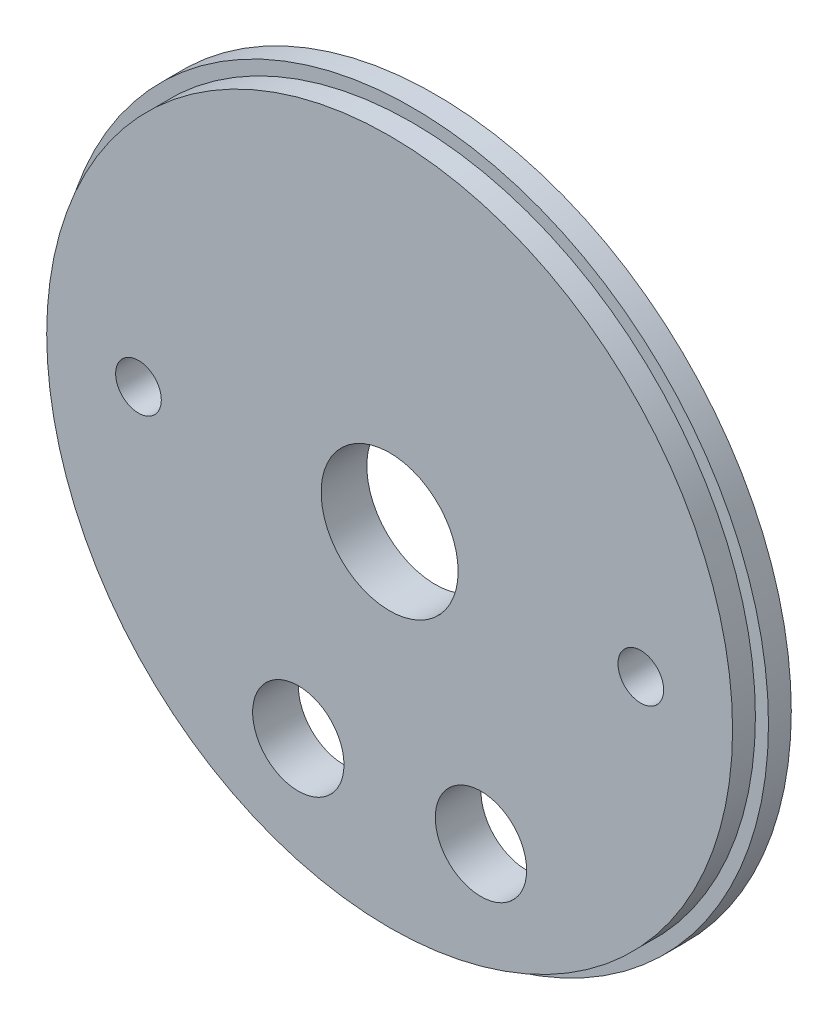
ISO-10303-21;
HEADER;
FILE_DESCRIPTION(('STEP AP214'),'2;1');
FILE_NAME('part.step','',(''),(''),'','','');
FILE_SCHEMA(('AUTOMOTIVE_DESIGN { 1 0 10303 214 1 1 1 1 }'));
ENDSEC;
DATA;
#1=APPLICATION_CONTEXT('core data for automotive mechanical design processes');
#2=APPLICATION_PROTOCOL_DEFINITION('international standard','automotive_design',2000,#1);
#3=PRODUCT_CONTEXT('',#1,'mechanical');
#4=PRODUCT('Part','Part','',(#3));
#5=PRODUCT_RELATED_PRODUCT_CATEGORY('part','',(#4));
#6=PRODUCT_DEFINITION_FORMATION('','',#4);
#7=PRODUCT_DEFINITION_CONTEXT('part definition',#1,'design');
#8=PRODUCT_DEFINITION('design','',#6,#7);
#9=PRODUCT_DEFINITION_SHAPE('','',#8);
#10=(LENGTH_UNIT() NAMED_UNIT(*) SI_UNIT(.MILLI.,.METRE.));
#11=(NAMED_UNIT(*) PLANE_ANGLE_UNIT() SI_UNIT($,.RADIAN.));
#12=(NAMED_UNIT(*) SI_UNIT($,.STERADIAN.) SOLID_ANGLE_UNIT());
#13=UNCERTAINTY_MEASURE_WITH_UNIT(LENGTH_MEASURE(1.E-05),#10,'distance_accuracy_value','');
#14=(GEOMETRIC_REPRESENTATION_CONTEXT(3) GLOBAL_UNCERTAINTY_ASSIGNED_CONTEXT((#13)) GLOBAL_UNIT_ASSIGNED_CONTEXT((#10,
#11,#12)) REPRESENTATION_CONTEXT('',''));
#15=CARTESIAN_POINT('',(0.,0.,0.));
#16=DIRECTION('',(0.,0.,1.));
#17=DIRECTION('',(1.,0.,0.));
#18=AXIS2_PLACEMENT_3D('',#15,#16,#17);
#19=CARTESIAN_POINT('',(0.,0.,3.175));
#20=DIRECTION('',(0.,0.,-1.));
#21=DIRECTION('',(-1.,0.,0.));
#22=AXIS2_PLACEMENT_3D('',#19,#20,#21);
#23=CYLINDRICAL_SURFACE('',#22,49.5046);
#24=CARTESIAN_POINT('',(0.,0.,3.175));
#25=DIRECTION('',(0.,0.,1.));
#26=DIRECTION('',(1.,0.,0.));
#27=AXIS2_PLACEMENT_3D('',#24,#25,#26);
#28=CIRCLE('',#27,49.5046);
#29=CARTESIAN_POINT('',(49.5046,0.,3.175));
#30=VERTEX_POINT('',#29);
#31=EDGE_CURVE('E40',#30,#30,#28,.T.);
#32=ORIENTED_EDGE('',*,*,#31,.F.);
#33=EDGE_LOOP('',(#32));
#34=FACE_BOUND('',#33,.T.);
#35=CARTESIAN_POINT('',(0.,0.,0.));
#36=DIRECTION('',(0.,0.,1.));
#37=DIRECTION('',(1.,0.,0.));
#38=AXIS2_PLACEMENT_3D('',#35,#36,#37);
#39=CIRCLE('',#38,49.5046);
#40=CARTESIAN_POINT('',(49.5046,0.,0.));
#41=VERTEX_POINT('',#40);
#42=EDGE_CURVE('E36',#41,#41,#39,.T.);
#43=ORIENTED_EDGE('',*,*,#42,.T.);
#44=EDGE_LOOP('',(#43));
#45=FACE_BOUND('',#44,.T.);
#46=ADVANCED_FACE('F33',(#34,#45),#23,.T.);
#47=CARTESIAN_POINT('',(0.,0.,3.175));
#48=DIRECTION('',(0.,0.,1.));
#49=DIRECTION('',(1.,0.,0.));
#50=AXIS2_PLACEMENT_3D('',#47,#48,#49);
#51=PLANE('',#50);
#52=CARTESIAN_POINT('',(0.,0.,3.175));
#53=DIRECTION('',(0.,0.,1.));
#54=DIRECTION('',(1.,0.,0.));
#55=AXIS2_PLACEMENT_3D('',#52,#53,#54);
#56=CIRCLE('',#55,47.6885);
#57=CARTESIAN_POINT('',(47.6885,0.,3.175));
#58=VERTEX_POINT('',#57);
#59=EDGE_CURVE('E10',#58,#58,#56,.T.);
#60=ORIENTED_EDGE('',*,*,#59,.F.);
#61=EDGE_LOOP('',(#60));
#62=FACE_BOUND('',#61,.T.);
#63=ORIENTED_EDGE('',*,*,#31,.T.);
#64=EDGE_LOOP('',(#63));
#65=FACE_BOUND('',#64,.T.);
#66=ADVANCED_FACE('F109',(#62,#65),#51,.T.);
#67=CARTESIAN_POINT('',(0.,0.,0.));
#68=DIRECTION('',(0.,0.,1.));
#69=DIRECTION('',(1.,0.,0.));
#70=AXIS2_PLACEMENT_3D('',#67,#68,#69);
#71=PLANE('',#70);
#72=CARTESIAN_POINT('',(12.7,-31.2353524431853,0.));
#73=DIRECTION('',(0.,0.,1.));
#74=DIRECTION('',(1.,0.,0.));
#75=AXIS2_PLACEMENT_3D('',#72,#73,#74);
#76=CIRCLE('',#75,6.35);
#77=CARTESIAN_POINT('',(19.05,-31.2353524431853,0.));
#78=VERTEX_POINT('',#77);
#79=EDGE_CURVE('E53',#78,#78,#76,.T.);
#80=ORIENTED_EDGE('',*,*,#79,.T.);
#81=EDGE_LOOP('',(#80));
#82=FACE_BOUND('',#81,.T.);
#83=CARTESIAN_POINT('',(-34.925,0.,0.));
#84=DIRECTION('',(0.,0.,1.));
#85=DIRECTION('',(1.,0.,0.));
#86=AXIS2_PLACEMENT_3D('',#83,#84,#85);
#87=CIRCLE('',#86,3.17500000000001);
#88=CARTESIAN_POINT('',(-31.75,0.,0.));
#89=VERTEX_POINT('',#88);
#90=EDGE_CURVE('E59',#89,#89,#87,.T.);
#91=ORIENTED_EDGE('',*,*,#90,.T.);
#92=EDGE_LOOP('',(#91));
#93=FACE_BOUND('',#92,.T.);
#94=CARTESIAN_POINT('',(34.925,0.,0.));
#95=DIRECTION('',(0.,0.,1.));
#96=DIRECTION('',(1.,0.,0.));
#97=AXIS2_PLACEMENT_3D('',#94,#95,#96);
#98=CIRCLE('',#97,3.175);
#99=CARTESIAN_POINT('',(38.1,0.,0.));
#100=VERTEX_POINT('',#99);
#101=EDGE_CURVE('E60',#100,#100,#98,.T.);
#102=ORIENTED_EDGE('',*,*,#101,.T.);
#103=EDGE_LOOP('',(#102));
#104=FACE_BOUND('',#103,.T.);
#105=CARTESIAN_POINT('',(0.,0.,0.));
#106=DIRECTION('',(0.,0.,1.));
#107=DIRECTION('',(1.,0.,0.));
#108=AXIS2_PLACEMENT_3D('',#105,#106,#107);
#109=CIRCLE('',#108,9.525);
#110=CARTESIAN_POINT('',(9.525,0.,0.));
#111=VERTEX_POINT('',#110);
#112=EDGE_CURVE('E71',#111,#111,#109,.T.);
#113=ORIENTED_EDGE('',*,*,#112,.T.);
#114=EDGE_LOOP('',(#113));
#115=FACE_BOUND('',#114,.T.);
#116=CARTESIAN_POINT('',(-12.7,-31.2353524431853,0.));
#117=DIRECTION('',(0.,0.,1.));
#118=DIRECTION('',(1.,0.,0.));
#119=AXIS2_PLACEMENT_3D('',#116,#117,#118);
#120=CIRCLE('',#119,6.35);
#121=CARTESIAN_POINT('',(-6.35,-31.2353524431853,0.));
#122=VERTEX_POINT('',#121);
#123=EDGE_CURVE('E49',#122,#122,#120,.T.);
#124=ORIENTED_EDGE('',*,*,#123,.T.);
#125=EDGE_LOOP('',(#124));
#126=FACE_BOUND('',#125,.T.);
#127=ORIENTED_EDGE('',*,*,#42,.F.);
#128=EDGE_LOOP('',(#127));
#129=FACE_BOUND('',#128,.T.);
#130=ADVANCED_FACE('F80',(#82,#93,#104,#115,#126,#129),#71,.F.);
#131=CARTESIAN_POINT('',(0.,0.,6.35));
#132=DIRECTION('',(0.,0.,-1.));
#133=DIRECTION('',(-1.,0.,0.));
#134=AXIS2_PLACEMENT_3D('',#131,#132,#133);
#135=CYLINDRICAL_SURFACE('',#134,47.6885);
#136=CARTESIAN_POINT('',(0.,0.,6.35));
#137=DIRECTION('',(0.,0.,1.));
#138=DIRECTION('',(1.,0.,0.));
#139=AXIS2_PLACEMENT_3D('',#136,#137,#138);
#140=CIRCLE('',#139,47.6885);
#141=CARTESIAN_POINT('',(47.6885,0.,6.35));
#142=VERTEX_POINT('',#141);
#143=EDGE_CURVE('E46',#142,#142,#140,.T.);
#144=ORIENTED_EDGE('',*,*,#143,.F.);
#145=EDGE_LOOP('',(#144));
#146=FACE_BOUND('',#145,.T.);
#147=ORIENTED_EDGE('',*,*,#59,.T.);
#148=EDGE_LOOP('',(#147));
#149=FACE_BOUND('',#148,.T.);
#150=ADVANCED_FACE('F95',(#146,#149),#135,.T.);
#151=CARTESIAN_POINT('',(0.,0.,6.35));
#152=DIRECTION('',(0.,0.,1.));
#153=DIRECTION('',(1.,0.,0.));
#154=AXIS2_PLACEMENT_3D('',#151,#152,#153);
#155=PLANE('',#154);
#156=CARTESIAN_POINT('',(12.7,-31.2353524431853,6.35));
#157=DIRECTION('',(0.,0.,1.));
#158=DIRECTION('',(1.,0.,0.));
#159=AXIS2_PLACEMENT_3D('',#156,#157,#158);
#160=CIRCLE('',#159,6.35);
#161=CARTESIAN_POINT('',(19.05,-31.2353524431853,6.35));
#162=VERTEX_POINT('',#161);
#163=EDGE_CURVE('E63',#162,#162,#160,.T.);
#164=ORIENTED_EDGE('',*,*,#163,.F.);
#165=EDGE_LOOP('',(#164));
#166=FACE_BOUND('',#165,.T.);
#167=CARTESIAN_POINT('',(-34.925,0.,6.35));
#168=DIRECTION('',(0.,0.,1.));
#169=DIRECTION('',(1.,0.,0.));
#170=AXIS2_PLACEMENT_3D('',#167,#168,#169);
#171=CIRCLE('',#170,3.17500000000001);
#172=CARTESIAN_POINT('',(-31.75,0.,6.35));
#173=VERTEX_POINT('',#172);
#174=EDGE_CURVE('E56',#173,#173,#171,.T.);
#175=ORIENTED_EDGE('',*,*,#174,.F.);
#176=EDGE_LOOP('',(#175));
#177=FACE_BOUND('',#176,.T.);
#178=CARTESIAN_POINT('',(34.925,0.,6.35));
#179=DIRECTION('',(0.,0.,1.));
#180=DIRECTION('',(1.,0.,0.));
#181=AXIS2_PLACEMENT_3D('',#178,#179,#180);
#182=CIRCLE('',#181,3.175);
#183=CARTESIAN_POINT('',(38.1,0.,6.35));
#184=VERTEX_POINT('',#183);
#185=EDGE_CURVE('E74',#184,#184,#182,.T.);
#186=ORIENTED_EDGE('',*,*,#185,.F.);
#187=EDGE_LOOP('',(#186));
#188=FACE_BOUND('',#187,.T.);
#189=CARTESIAN_POINT('',(0.,0.,6.35));
#190=DIRECTION('',(0.,0.,1.));
#191=DIRECTION('',(1.,0.,0.));
#192=AXIS2_PLACEMENT_3D('',#189,#190,#191);
#193=CIRCLE('',#192,9.525);
#194=CARTESIAN_POINT('',(9.525,0.,6.35));
#195=VERTEX_POINT('',#194);
#196=EDGE_CURVE('E68',#195,#195,#193,.T.);
#197=ORIENTED_EDGE('',*,*,#196,.F.);
#198=EDGE_LOOP('',(#197));
#199=FACE_BOUND('',#198,.T.);
#200=CARTESIAN_POINT('',(-12.7,-31.2353524431853,6.35));
#201=DIRECTION('',(0.,0.,1.));
#202=DIRECTION('',(1.,0.,0.));
#203=AXIS2_PLACEMENT_3D('',#200,#201,#202);
#204=CIRCLE('',#203,6.35);
#205=CARTESIAN_POINT('',(-6.35,-31.2353524431853,6.35));
#206=VERTEX_POINT('',#205);
#207=EDGE_CURVE('E50',#206,#206,#204,.T.);
#208=ORIENTED_EDGE('',*,*,#207,.F.);
#209=EDGE_LOOP('',(#208));
#210=FACE_BOUND('',#209,.T.);
#211=ORIENTED_EDGE('',*,*,#143,.T.);
#212=EDGE_LOOP('',(#211));
#213=FACE_BOUND('',#212,.T.);
#214=ADVANCED_FACE('F91',(#166,#177,#188,#199,#210,#213),#155,.T.);
#215=CARTESIAN_POINT('',(-12.7,-31.2353524431853,0.));
#216=DIRECTION('',(0.,0.,1.));
#217=DIRECTION('',(1.,0.,0.));
#218=AXIS2_PLACEMENT_3D('',#215,#216,#217);
#219=CYLINDRICAL_SURFACE('',#218,6.35);
#220=ORIENTED_EDGE('',*,*,#123,.F.);
#221=EDGE_LOOP('',(#220));
#222=FACE_BOUND('',#221,.T.);
#223=ORIENTED_EDGE('',*,*,#207,.T.);
#224=EDGE_LOOP('',(#223));
#225=FACE_BOUND('',#224,.T.);
#226=ADVANCED_FACE('F94',(#222,#225),#219,.F.);
#227=CARTESIAN_POINT('',(0.,0.,0.));
#228=DIRECTION('',(0.,0.,1.));
#229=DIRECTION('',(1.,0.,0.));
#230=AXIS2_PLACEMENT_3D('',#227,#228,#229);
#231=CYLINDRICAL_SURFACE('',#230,9.525);
#232=ORIENTED_EDGE('',*,*,#112,.F.);
#233=EDGE_LOOP('',(#232));
#234=FACE_BOUND('',#233,.T.);
#235=ORIENTED_EDGE('',*,*,#196,.T.);
#236=EDGE_LOOP('',(#235));
#237=FACE_BOUND('',#236,.T.);
#238=ADVANCED_FACE('F87',(#234,#237),#231,.F.);
#239=CARTESIAN_POINT('',(34.925,0.,0.));
#240=DIRECTION('',(0.,0.,1.));
#241=DIRECTION('',(1.,0.,0.));
#242=AXIS2_PLACEMENT_3D('',#239,#240,#241);
#243=CYLINDRICAL_SURFACE('',#242,3.175);
#244=ORIENTED_EDGE('',*,*,#101,.F.);
#245=EDGE_LOOP('',(#244));
#246=FACE_BOUND('',#245,.T.);
#247=ORIENTED_EDGE('',*,*,#185,.T.);
#248=EDGE_LOOP('',(#247));
#249=FACE_BOUND('',#248,.T.);
#250=ADVANCED_FACE('F83',(#246,#249),#243,.F.);
#251=CARTESIAN_POINT('',(-34.925,0.,0.));
#252=DIRECTION('',(0.,0.,1.));
#253=DIRECTION('',(1.,0.,0.));
#254=AXIS2_PLACEMENT_3D('',#251,#252,#253);
#255=CYLINDRICAL_SURFACE('',#254,3.17500000000001);
#256=ORIENTED_EDGE('',*,*,#90,.F.);
#257=EDGE_LOOP('',(#256));
#258=FACE_BOUND('',#257,.T.);
#259=ORIENTED_EDGE('',*,*,#174,.T.);
#260=EDGE_LOOP('',(#259));
#261=FACE_BOUND('',#260,.T.);
#262=ADVANCED_FACE('F86',(#258,#261),#255,.F.);
#263=CARTESIAN_POINT('',(12.7,-31.2353524431853,0.));
#264=DIRECTION('',(0.,0.,1.));
#265=DIRECTION('',(1.,0.,0.));
#266=AXIS2_PLACEMENT_3D('',#263,#264,#265);
#267=CYLINDRICAL_SURFACE('',#266,6.35);
#268=ORIENTED_EDGE('',*,*,#79,.F.);
#269=EDGE_LOOP('',(#268));
#270=FACE_BOUND('',#269,.T.);
#271=ORIENTED_EDGE('',*,*,#163,.T.);
#272=EDGE_LOOP('',(#271));
#273=FACE_BOUND('',#272,.T.);
#274=ADVANCED_FACE('F171',(#270,#273),#267,.F.);
#275=CLOSED_SHELL('',(#46,#66,#130,#150,#214,#226,#238,#250,#262,#274));
#276=MANIFOLD_SOLID_BREP('B2',#275);
#277=ADVANCED_BREP_SHAPE_REPRESENTATION('',(#18,#276),#14);
#278=SHAPE_DEFINITION_REPRESENTATION(#9,#277);
ENDSEC;
END-ISO-10303-21;
